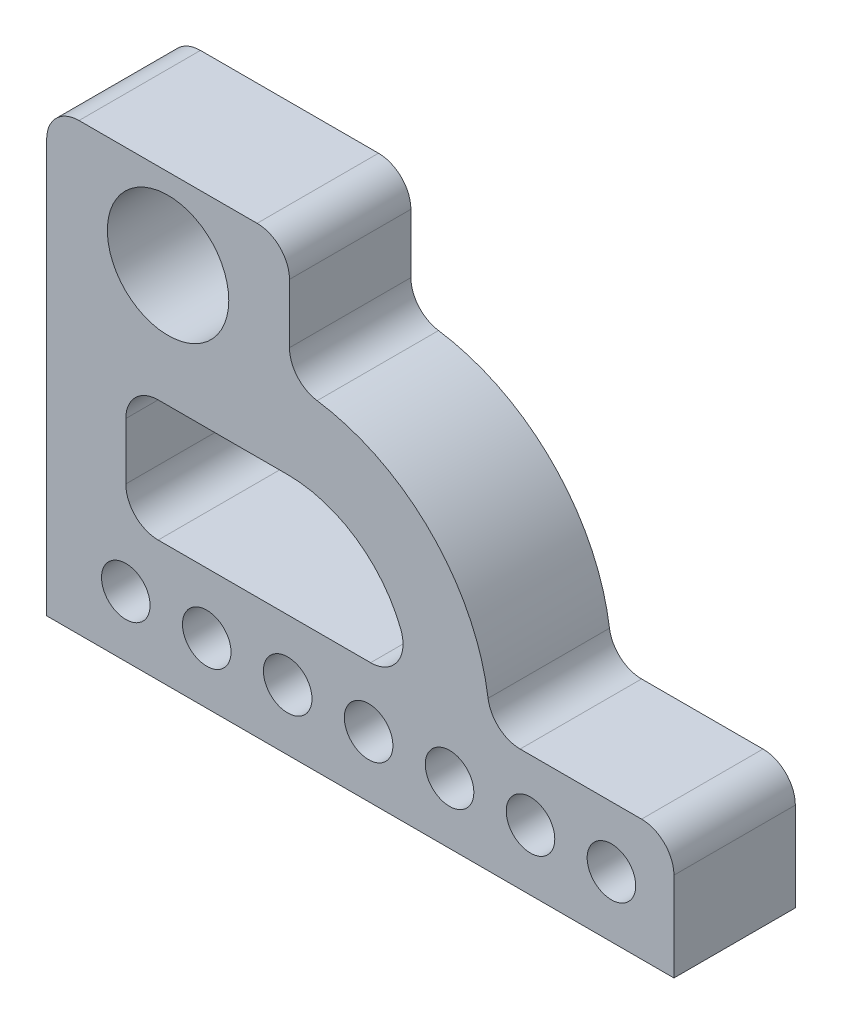
ISO-10303-21;
HEADER;
FILE_DESCRIPTION(('STEP AP214'),'2;1');
FILE_NAME('part.step','',(''),(''),'','','');
FILE_SCHEMA(('AUTOMOTIVE_DESIGN { 1 0 10303 214 1 1 1 1 }'));
ENDSEC;
DATA;
#1=APPLICATION_CONTEXT('core data for automotive mechanical design processes');
#2=APPLICATION_PROTOCOL_DEFINITION('international standard','automotive_design',2000,#1);
#3=PRODUCT_CONTEXT('',#1,'mechanical');
#4=PRODUCT('Part','Part','',(#3));
#5=PRODUCT_RELATED_PRODUCT_CATEGORY('part','',(#4));
#6=PRODUCT_DEFINITION_FORMATION('','',#4);
#7=PRODUCT_DEFINITION_CONTEXT('part definition',#1,'design');
#8=PRODUCT_DEFINITION('design','',#6,#7);
#9=PRODUCT_DEFINITION_SHAPE('','',#8);
#10=(LENGTH_UNIT() NAMED_UNIT(*) SI_UNIT(.MILLI.,.METRE.));
#11=(NAMED_UNIT(*) PLANE_ANGLE_UNIT() SI_UNIT($,.RADIAN.));
#12=(NAMED_UNIT(*) SI_UNIT($,.STERADIAN.) SOLID_ANGLE_UNIT());
#13=UNCERTAINTY_MEASURE_WITH_UNIT(LENGTH_MEASURE(1.E-05),#10,'distance_accuracy_value','');
#14=(GEOMETRIC_REPRESENTATION_CONTEXT(3) GLOBAL_UNCERTAINTY_ASSIGNED_CONTEXT((#13)) GLOBAL_UNIT_ASSIGNED_CONTEXT((#10,
#11,#12)) REPRESENTATION_CONTEXT('',''));
#15=CARTESIAN_POINT('',(0.,0.,0.));
#16=DIRECTION('',(0.,0.,1.));
#17=DIRECTION('',(1.,0.,0.));
#18=AXIS2_PLACEMENT_3D('',#15,#16,#17);
#19=CARTESIAN_POINT('',(-51.5559205852614,86.4434594596879,30.));
#20=DIRECTION('',(0.,0.,-1.));
#21=DIRECTION('',(-1.,0.,0.));
#22=AXIS2_PLACEMENT_3D('',#19,#20,#21);
#23=PLANE('',#22);
#24=CARTESIAN_POINT('',(-29.5559205852614,74.4434594596878,30.));
#25=DIRECTION('',(0.,0.,1.));
#26=DIRECTION('',(1.,0.,0.));
#27=AXIS2_PLACEMENT_3D('',#24,#25,#26);
#28=CIRCLE('',#27,15.);
#29=CARTESIAN_POINT('',(-14.5559205852614,74.4434594596878,30.));
#30=VERTEX_POINT('',#29);
#31=EDGE_CURVE('E260',#30,#30,#28,.T.);
#32=ORIENTED_EDGE('',*,*,#31,.F.);
#33=EDGE_LOOP('',(#32));
#34=FACE_BOUND('',#33,.T.);
#35=DIRECTION('',(0.,-1.,0.));
#36=VECTOR('',#35,1.);
#37=CARTESIAN_POINT('',(-59.5559205852614,-15.5565405403121,30.));
#38=LINE('',#37,#36);
#39=CARTESIAN_POINT('',(-59.5559205852614,86.4434594596878,30.));
#40=VERTEX_POINT('',#39);
#41=CARTESIAN_POINT('',(-59.5559205852614,-15.5565405403121,30.));
#42=VERTEX_POINT('',#41);
#43=EDGE_CURVE('E270',#40,#42,#38,.T.);
#44=ORIENTED_EDGE('',*,*,#43,.T.);
#45=DIRECTION('',(1.,0.,0.));
#46=VECTOR('',#45,1.);
#47=CARTESIAN_POINT('',(-59.5559205852614,-15.5565405403121,30.));
#48=LINE('',#47,#46);
#49=CARTESIAN_POINT('',(95.4440794147386,-15.5565405403121,30.));
#50=VERTEX_POINT('',#49);
#51=EDGE_CURVE('E271',#42,#50,#48,.T.);
#52=ORIENTED_EDGE('',*,*,#51,.T.);
#53=DIRECTION('',(0.,1.,0.));
#54=VECTOR('',#53,1.);
#55=CARTESIAN_POINT('',(95.4440794147386,-15.5565405403121,30.));
#56=LINE('',#55,#54);
#57=CARTESIAN_POINT('',(95.4440794147386,6.4434594596878,30.));
#58=VERTEX_POINT('',#57);
#59=EDGE_CURVE('E274',#50,#58,#56,.T.);
#60=ORIENTED_EDGE('',*,*,#59,.T.);
#61=CARTESIAN_POINT('',(87.4440794147386,6.44345945968786,30.));
#62=DIRECTION('',(0.,0.,1.));
#63=DIRECTION('',(1.,0.,0.));
#64=AXIS2_PLACEMENT_3D('',#61,#62,#63);
#65=CIRCLE('',#64,8.);
#66=CARTESIAN_POINT('',(87.4440794147386,14.4434594596879,30.));
#67=VERTEX_POINT('',#66);
#68=EDGE_CURVE('E277',#58,#67,#65,.T.);
#69=ORIENTED_EDGE('',*,*,#68,.T.);
#70=DIRECTION('',(-1.,0.,0.));
#71=VECTOR('',#70,1.);
#72=CARTESIAN_POINT('',(87.4440794147386,14.4434594596879,30.));
#73=LINE('',#72,#71);
#74=CARTESIAN_POINT('',(57.4456264653803,14.4434594596879,30.));
#75=VERTEX_POINT('',#74);
#76=EDGE_CURVE('E282',#67,#75,#73,.T.);
#77=ORIENTED_EDGE('',*,*,#76,.T.);
#78=CARTESIAN_POINT('',(57.4456264653803,22.4434594596879,30.));
#79=DIRECTION('',(0.,0.,-1.));
#80=DIRECTION('',(-1.,0.,0.));
#81=AXIS2_PLACEMENT_3D('',#78,#79,#80);
#82=CIRCLE('',#81,8.);
#83=CARTESIAN_POINT('',(49.5220917805002,21.3400111838258,30.));
#84=VERTEX_POINT('',#83);
#85=EDGE_CURVE('E281',#75,#84,#82,.T.);
#86=ORIENTED_EDGE('',*,*,#85,.T.);
#87=CARTESIAN_POINT('',(0.,14.4434594596879,30.));
#88=DIRECTION('',(0.,0.,1.));
#89=DIRECTION('',(1.,0.,0.));
#90=AXIS2_PLACEMENT_3D('',#87,#88,#89);
#91=CIRCLE('',#90,50.);
#92=CARTESIAN_POINT('',(7.27937880580915,63.9107278722608,30.));
#93=VERTEX_POINT('',#92);
#94=EDGE_CURVE('E287',#84,#93,#91,.T.);
#95=ORIENTED_EDGE('',*,*,#94,.T.);
#96=CARTESIAN_POINT('',(8.44407941473862,71.8254908182725,30.));
#97=DIRECTION('',(0.,0.,-1.));
#98=DIRECTION('',(-1.,0.,0.));
#99=AXIS2_PLACEMENT_3D('',#96,#97,#98);
#100=CIRCLE('',#99,8.);
#101=CARTESIAN_POINT('',(0.444079414738612,71.8254908182725,30.));
#102=VERTEX_POINT('',#101);
#103=EDGE_CURVE('E290',#93,#102,#100,.T.);
#104=ORIENTED_EDGE('',*,*,#103,.T.);
#105=DIRECTION('',(0.,1.,0.));
#106=VECTOR('',#105,1.);
#107=CARTESIAN_POINT('',(0.444079414738613,86.4434594596878,30.));
#108=LINE('',#107,#106);
#109=CARTESIAN_POINT('',(0.444079414738613,86.4434594596878,30.));
#110=VERTEX_POINT('',#109);
#111=EDGE_CURVE('E291',#102,#110,#108,.T.);
#112=ORIENTED_EDGE('',*,*,#111,.T.);
#113=CARTESIAN_POINT('',(-7.55592058526139,86.4434594596879,30.));
#114=DIRECTION('',(0.,0.,1.));
#115=DIRECTION('',(1.,0.,0.));
#116=AXIS2_PLACEMENT_3D('',#113,#114,#115);
#117=CIRCLE('',#116,8.);
#118=CARTESIAN_POINT('',(-7.55592058526144,94.4434594596879,30.));
#119=VERTEX_POINT('',#118);
#120=EDGE_CURVE('E296',#110,#119,#117,.T.);
#121=ORIENTED_EDGE('',*,*,#120,.T.);
#122=DIRECTION('',(-1.,0.,0.));
#123=VECTOR('',#122,1.);
#124=CARTESIAN_POINT('',(-51.5559205852613,94.4434594596878,30.));
#125=LINE('',#124,#123);
#126=CARTESIAN_POINT('',(-51.5559205852613,94.4434594596878,30.));
#127=VERTEX_POINT('',#126);
#128=EDGE_CURVE('E298',#119,#127,#125,.T.);
#129=ORIENTED_EDGE('',*,*,#128,.T.);
#130=CARTESIAN_POINT('',(-51.5559205852614,86.4434594596879,30.));
#131=DIRECTION('',(0.,0.,1.));
#132=DIRECTION('',(-1.,0.,0.));
#133=AXIS2_PLACEMENT_3D('',#130,#131,#132);
#134=CIRCLE('',#133,8.);
#135=EDGE_CURVE('E302',#127,#40,#134,.T.);
#136=ORIENTED_EDGE('',*,*,#135,.T.);
#137=EDGE_LOOP('',(#44,#52,#60,#69,#77,#86,#95,#104,#112,#121,#129,#136));
#138=FACE_BOUND('',#137,.T.);
#139=CARTESIAN_POINT('',(0.,14.4434594596879,30.));
#140=DIRECTION('',(0.,0.,1.));
#141=DIRECTION('',(1.,0.,0.));
#142=AXIS2_PLACEMENT_3D('',#139,#140,#141);
#143=CIRCLE('',#142,30.);
#144=CARTESIAN_POINT('',(27.946229361708,25.3525503687788,30.));
#145=VERTEX_POINT('',#144);
#146=CARTESIAN_POINT('',(0.,44.4434594596879,30.));
#147=VERTEX_POINT('',#146);
#148=EDGE_CURVE('E180',#145,#147,#143,.T.);
#149=ORIENTED_EDGE('',*,*,#148,.F.);
#150=CARTESIAN_POINT('',(20.4939015319192,22.4434594596879,30.));
#151=DIRECTION('',(0.,0.,1.));
#152=DIRECTION('',(1.,0.,0.));
#153=AXIS2_PLACEMENT_3D('',#150,#151,#152);
#154=CIRCLE('',#153,8.);
#155=CARTESIAN_POINT('',(20.4939015319192,14.4434594596879,30.));
#156=VERTEX_POINT('',#155);
#157=EDGE_CURVE('E220',#156,#145,#154,.T.);
#158=ORIENTED_EDGE('',*,*,#157,.F.);
#159=DIRECTION('',(1.,0.,0.));
#160=VECTOR('',#159,1.);
#161=CARTESIAN_POINT('',(-32.,14.4434594596879,30.));
#162=LINE('',#161,#160);
#163=CARTESIAN_POINT('',(-32.,14.4434594596879,30.));
#164=VERTEX_POINT('',#163);
#165=EDGE_CURVE('E215',#164,#156,#162,.T.);
#166=ORIENTED_EDGE('',*,*,#165,.F.);
#167=CARTESIAN_POINT('',(-32.,22.4434594596879,30.));
#168=DIRECTION('',(0.,0.,1.));
#169=DIRECTION('',(-1.,0.,0.));
#170=AXIS2_PLACEMENT_3D('',#167,#168,#169);
#171=CIRCLE('',#170,8.);
#172=CARTESIAN_POINT('',(-40.,22.4434594596879,30.));
#173=VERTEX_POINT('',#172);
#174=EDGE_CURVE('E213',#173,#164,#171,.T.);
#175=ORIENTED_EDGE('',*,*,#174,.F.);
#176=DIRECTION('',(0.,-1.,0.));
#177=VECTOR('',#176,1.);
#178=CARTESIAN_POINT('',(-40.,36.4434594596878,30.));
#179=LINE('',#178,#177);
#180=CARTESIAN_POINT('',(-40.,36.4434594596878,30.));
#181=VERTEX_POINT('',#180);
#182=EDGE_CURVE('E203',#181,#173,#179,.T.);
#183=ORIENTED_EDGE('',*,*,#182,.F.);
#184=CARTESIAN_POINT('',(-32.,36.4434594596879,30.));
#185=DIRECTION('',(0.,0.,1.));
#186=DIRECTION('',(-1.,0.,0.));
#187=AXIS2_PLACEMENT_3D('',#184,#185,#186);
#188=CIRCLE('',#187,8.);
#189=CARTESIAN_POINT('',(-32.,44.4434594596879,30.));
#190=VERTEX_POINT('',#189);
#191=EDGE_CURVE('E202',#190,#181,#188,.T.);
#192=ORIENTED_EDGE('',*,*,#191,.F.);
#193=DIRECTION('',(-1.,0.,0.));
#194=VECTOR('',#193,1.);
#195=CARTESIAN_POINT('',(0.,44.4434594596879,30.));
#196=LINE('',#195,#194);
#197=EDGE_CURVE('E186',#147,#190,#196,.T.);
#198=ORIENTED_EDGE('',*,*,#197,.F.);
#199=EDGE_LOOP('',(#149,#158,#166,#175,#183,#192,#198));
#200=FACE_BOUND('',#199,.T.);
#201=CARTESIAN_POINT('',(-40.,-0.556540540312144,30.));
#202=DIRECTION('',(0.,0.,1.));
#203=DIRECTION('',(1.,0.,0.));
#204=AXIS2_PLACEMENT_3D('',#201,#202,#203);
#205=CIRCLE('',#204,6.);
#206=CARTESIAN_POINT('',(-34.,-0.556540540312144,30.));
#207=VERTEX_POINT('',#206);
#208=EDGE_CURVE('E225',#207,#207,#205,.T.);
#209=ORIENTED_EDGE('',*,*,#208,.F.);
#210=EDGE_LOOP('',(#209));
#211=FACE_BOUND('',#210,.T.);
#212=CARTESIAN_POINT('',(-20.,-0.556540540312144,30.));
#213=DIRECTION('',(0.,0.,1.));
#214=DIRECTION('',(1.,0.,0.));
#215=AXIS2_PLACEMENT_3D('',#212,#213,#214);
#216=CIRCLE('',#215,6.);
#217=CARTESIAN_POINT('',(-14.,-0.556540540312144,30.));
#218=VERTEX_POINT('',#217);
#219=EDGE_CURVE('E746',#218,#218,#216,.T.);
#220=ORIENTED_EDGE('',*,*,#219,.F.);
#221=EDGE_LOOP('',(#220));
#222=FACE_BOUND('',#221,.T.);
#223=CARTESIAN_POINT('',(0.,-0.556540540312144,30.));
#224=DIRECTION('',(0.,0.,1.));
#225=DIRECTION('',(1.,0.,0.));
#226=AXIS2_PLACEMENT_3D('',#223,#224,#225);
#227=CIRCLE('',#226,6.);
#228=CARTESIAN_POINT('',(6.,-0.556540540312144,30.));
#229=VERTEX_POINT('',#228);
#230=EDGE_CURVE('E739',#229,#229,#227,.T.);
#231=ORIENTED_EDGE('',*,*,#230,.F.);
#232=EDGE_LOOP('',(#231));
#233=FACE_BOUND('',#232,.T.);
#234=CARTESIAN_POINT('',(20.,-0.556540540312144,30.));
#235=DIRECTION('',(0.,0.,1.));
#236=DIRECTION('',(1.,0.,0.));
#237=AXIS2_PLACEMENT_3D('',#234,#235,#236);
#238=CIRCLE('',#237,6.);
#239=CARTESIAN_POINT('',(26.,-0.556540540312144,30.));
#240=VERTEX_POINT('',#239);
#241=EDGE_CURVE('E729',#240,#240,#238,.T.);
#242=ORIENTED_EDGE('',*,*,#241,.F.);
#243=EDGE_LOOP('',(#242));
#244=FACE_BOUND('',#243,.T.);
#245=CARTESIAN_POINT('',(40.,-0.556540540312144,30.));
#246=DIRECTION('',(0.,0.,1.));
#247=DIRECTION('',(1.,0.,0.));
#248=AXIS2_PLACEMENT_3D('',#245,#246,#247);
#249=CIRCLE('',#248,6.);
#250=CARTESIAN_POINT('',(46.,-0.556540540312144,30.));
#251=VERTEX_POINT('',#250);
#252=EDGE_CURVE('E725',#251,#251,#249,.T.);
#253=ORIENTED_EDGE('',*,*,#252,.F.);
#254=EDGE_LOOP('',(#253));
#255=FACE_BOUND('',#254,.T.);
#256=CARTESIAN_POINT('',(60.,-0.556540540312144,30.));
#257=DIRECTION('',(0.,0.,1.));
#258=DIRECTION('',(1.,0.,0.));
#259=AXIS2_PLACEMENT_3D('',#256,#257,#258);
#260=CIRCLE('',#259,6.);
#261=CARTESIAN_POINT('',(66.,-0.556540540312144,30.));
#262=VERTEX_POINT('',#261);
#263=EDGE_CURVE('E714',#262,#262,#260,.T.);
#264=ORIENTED_EDGE('',*,*,#263,.F.);
#265=EDGE_LOOP('',(#264));
#266=FACE_BOUND('',#265,.T.);
#267=CARTESIAN_POINT('',(80.,-0.556540540312144,30.));
#268=DIRECTION('',(0.,0.,1.));
#269=DIRECTION('',(1.,0.,0.));
#270=AXIS2_PLACEMENT_3D('',#267,#268,#269);
#271=CIRCLE('',#270,6.);
#272=CARTESIAN_POINT('',(86.,-0.556540540312144,30.));
#273=VERTEX_POINT('',#272);
#274=EDGE_CURVE('E704',#273,#273,#271,.T.);
#275=ORIENTED_EDGE('',*,*,#274,.F.);
#276=EDGE_LOOP('',(#275));
#277=FACE_BOUND('',#276,.T.);
#278=ADVANCED_FACE('F44',(#34,#138,#200,#211,#222,#233,#244,#255,#266,#277),#23,.F.);
#279=CARTESIAN_POINT('',(-51.5559205852614,86.4434594596879,0.));
#280=DIRECTION('',(0.,0.,-1.));
#281=DIRECTION('',(-1.,0.,0.));
#282=AXIS2_PLACEMENT_3D('',#279,#280,#281);
#283=PLANE('',#282);
#284=CARTESIAN_POINT('',(60.,-0.556540540312144,0.));
#285=DIRECTION('',(0.,0.,1.));
#286=DIRECTION('',(1.,0.,0.));
#287=AXIS2_PLACEMENT_3D('',#284,#285,#286);
#288=CIRCLE('',#287,6.);
#289=CARTESIAN_POINT('',(66.,-0.556540540312144,0.));
#290=VERTEX_POINT('',#289);
#291=EDGE_CURVE('E713',#290,#290,#288,.T.);
#292=ORIENTED_EDGE('',*,*,#291,.T.);
#293=EDGE_LOOP('',(#292));
#294=FACE_BOUND('',#293,.T.);
#295=CARTESIAN_POINT('',(20.,-0.556540540312144,0.));
#296=DIRECTION('',(0.,0.,1.));
#297=DIRECTION('',(1.,0.,0.));
#298=AXIS2_PLACEMENT_3D('',#295,#296,#297);
#299=CIRCLE('',#298,6.);
#300=CARTESIAN_POINT('',(26.,-0.556540540312144,0.));
#301=VERTEX_POINT('',#300);
#302=EDGE_CURVE('E726',#301,#301,#299,.T.);
#303=ORIENTED_EDGE('',*,*,#302,.T.);
#304=EDGE_LOOP('',(#303));
#305=FACE_BOUND('',#304,.T.);
#306=CARTESIAN_POINT('',(-20.,-0.556540540312144,0.));
#307=DIRECTION('',(0.,0.,1.));
#308=DIRECTION('',(1.,0.,0.));
#309=AXIS2_PLACEMENT_3D('',#306,#307,#308);
#310=CIRCLE('',#309,6.);
#311=CARTESIAN_POINT('',(-14.,-0.556540540312144,0.));
#312=VERTEX_POINT('',#311);
#313=EDGE_CURVE('E745',#312,#312,#310,.T.);
#314=ORIENTED_EDGE('',*,*,#313,.T.);
#315=EDGE_LOOP('',(#314));
#316=FACE_BOUND('',#315,.T.);
#317=CARTESIAN_POINT('',(20.4939015319192,22.4434594596879,0.));
#318=DIRECTION('',(0.,0.,1.));
#319=DIRECTION('',(1.,0.,0.));
#320=AXIS2_PLACEMENT_3D('',#317,#318,#319);
#321=CIRCLE('',#320,8.);
#322=CARTESIAN_POINT('',(20.4939015319192,14.4434594596879,0.));
#323=VERTEX_POINT('',#322);
#324=CARTESIAN_POINT('',(27.946229361708,25.3525503687788,0.));
#325=VERTEX_POINT('',#324);
#326=EDGE_CURVE('E190',#323,#325,#321,.T.);
#327=ORIENTED_EDGE('',*,*,#326,.T.);
#328=CARTESIAN_POINT('',(0.,14.4434594596879,0.));
#329=DIRECTION('',(0.,0.,1.));
#330=DIRECTION('',(1.,0.,0.));
#331=AXIS2_PLACEMENT_3D('',#328,#329,#330);
#332=CIRCLE('',#331,30.);
#333=CARTESIAN_POINT('',(0.,44.4434594596879,0.));
#334=VERTEX_POINT('',#333);
#335=EDGE_CURVE('E69',#325,#334,#332,.T.);
#336=ORIENTED_EDGE('',*,*,#335,.T.);
#337=DIRECTION('',(-1.,0.,0.));
#338=VECTOR('',#337,1.);
#339=CARTESIAN_POINT('',(0.,44.4434594596879,0.));
#340=LINE('',#339,#338);
#341=CARTESIAN_POINT('',(-32.,44.4434594596879,0.));
#342=VERTEX_POINT('',#341);
#343=EDGE_CURVE('E194',#334,#342,#340,.T.);
#344=ORIENTED_EDGE('',*,*,#343,.T.);
#345=CARTESIAN_POINT('',(-32.,36.4434594596879,0.));
#346=DIRECTION('',(0.,0.,1.));
#347=DIRECTION('',(-1.,0.,0.));
#348=AXIS2_PLACEMENT_3D('',#345,#346,#347);
#349=CIRCLE('',#348,8.);
#350=CARTESIAN_POINT('',(-40.,36.4434594596878,0.));
#351=VERTEX_POINT('',#350);
#352=EDGE_CURVE('E224',#342,#351,#349,.T.);
#353=ORIENTED_EDGE('',*,*,#352,.T.);
#354=DIRECTION('',(0.,-1.,0.));
#355=VECTOR('',#354,1.);
#356=CARTESIAN_POINT('',(-40.,36.4434594596878,0.));
#357=LINE('',#356,#355);
#358=CARTESIAN_POINT('',(-40.,22.4434594596879,0.));
#359=VERTEX_POINT('',#358);
#360=EDGE_CURVE('E227',#351,#359,#357,.T.);
#361=ORIENTED_EDGE('',*,*,#360,.T.);
#362=CARTESIAN_POINT('',(-32.,22.4434594596879,0.));
#363=DIRECTION('',(0.,0.,1.));
#364=DIRECTION('',(-1.,0.,0.));
#365=AXIS2_PLACEMENT_3D('',#362,#363,#364);
#366=CIRCLE('',#365,8.);
#367=CARTESIAN_POINT('',(-32.,14.4434594596879,0.));
#368=VERTEX_POINT('',#367);
#369=EDGE_CURVE('E232',#359,#368,#366,.T.);
#370=ORIENTED_EDGE('',*,*,#369,.T.);
#371=DIRECTION('',(1.,0.,0.));
#372=VECTOR('',#371,1.);
#373=CARTESIAN_POINT('',(-32.,14.4434594596879,0.));
#374=LINE('',#373,#372);
#375=EDGE_CURVE('E240',#368,#323,#374,.T.);
#376=ORIENTED_EDGE('',*,*,#375,.T.);
#377=EDGE_LOOP('',(#327,#336,#344,#353,#361,#370,#376));
#378=FACE_BOUND('',#377,.T.);
#379=CARTESIAN_POINT('',(-29.5559205852614,74.4434594596878,0.));
#380=DIRECTION('',(0.,0.,1.));
#381=DIRECTION('',(1.,0.,0.));
#382=AXIS2_PLACEMENT_3D('',#379,#380,#381);
#383=CIRCLE('',#382,15.);
#384=CARTESIAN_POINT('',(-14.5559205852614,74.4434594596878,0.));
#385=VERTEX_POINT('',#384);
#386=EDGE_CURVE('E193',#385,#385,#383,.T.);
#387=ORIENTED_EDGE('',*,*,#386,.T.);
#388=EDGE_LOOP('',(#387));
#389=FACE_BOUND('',#388,.T.);
#390=DIRECTION('',(0.,-1.,0.));
#391=VECTOR('',#390,1.);
#392=CARTESIAN_POINT('',(-59.5559205852614,-15.5565405403121,0.));
#393=LINE('',#392,#391);
#394=CARTESIAN_POINT('',(-59.5559205852614,86.4434594596878,0.));
#395=VERTEX_POINT('',#394);
#396=CARTESIAN_POINT('',(-59.5559205852614,-15.5565405403121,0.));
#397=VERTEX_POINT('',#396);
#398=EDGE_CURVE('E261',#395,#397,#393,.T.);
#399=ORIENTED_EDGE('',*,*,#398,.F.);
#400=CARTESIAN_POINT('',(-51.5559205852614,86.4434594596879,0.));
#401=DIRECTION('',(0.,0.,1.));
#402=DIRECTION('',(-1.,0.,0.));
#403=AXIS2_PLACEMENT_3D('',#400,#401,#402);
#404=CIRCLE('',#403,8.);
#405=CARTESIAN_POINT('',(-51.5559205852613,94.4434594596878,0.));
#406=VERTEX_POINT('',#405);
#407=EDGE_CURVE('E275',#406,#395,#404,.T.);
#408=ORIENTED_EDGE('',*,*,#407,.F.);
#409=DIRECTION('',(-1.,0.,0.));
#410=VECTOR('',#409,1.);
#411=CARTESIAN_POINT('',(-51.5559205852613,94.4434594596878,0.));
#412=LINE('',#411,#410);
#413=CARTESIAN_POINT('',(-7.55592058526144,94.4434594596879,0.));
#414=VERTEX_POINT('',#413);
#415=EDGE_CURVE('E337',#414,#406,#412,.T.);
#416=ORIENTED_EDGE('',*,*,#415,.F.);
#417=CARTESIAN_POINT('',(-7.55592058526139,86.4434594596879,0.));
#418=DIRECTION('',(0.,0.,1.));
#419=DIRECTION('',(1.,0.,0.));
#420=AXIS2_PLACEMENT_3D('',#417,#418,#419);
#421=CIRCLE('',#420,8.);
#422=CARTESIAN_POINT('',(0.444079414738613,86.4434594596878,0.));
#423=VERTEX_POINT('',#422);
#424=EDGE_CURVE('E334',#423,#414,#421,.T.);
#425=ORIENTED_EDGE('',*,*,#424,.F.);
#426=DIRECTION('',(0.,1.,0.));
#427=VECTOR('',#426,1.);
#428=CARTESIAN_POINT('',(0.444079414738613,86.4434594596878,0.));
#429=LINE('',#428,#427);
#430=CARTESIAN_POINT('',(0.444079414738612,71.8254908182725,0.));
#431=VERTEX_POINT('',#430);
#432=EDGE_CURVE('E328',#431,#423,#429,.T.);
#433=ORIENTED_EDGE('',*,*,#432,.F.);
#434=CARTESIAN_POINT('',(8.44407941473862,71.8254908182725,0.));
#435=DIRECTION('',(0.,0.,-1.));
#436=DIRECTION('',(-1.,0.,0.));
#437=AXIS2_PLACEMENT_3D('',#434,#435,#436);
#438=CIRCLE('',#437,8.);
#439=CARTESIAN_POINT('',(7.27937880580915,63.9107278722608,0.));
#440=VERTEX_POINT('',#439);
#441=EDGE_CURVE('E330',#440,#431,#438,.T.);
#442=ORIENTED_EDGE('',*,*,#441,.F.);
#443=CARTESIAN_POINT('',(0.,14.4434594596879,0.));
#444=DIRECTION('',(0.,0.,1.));
#445=DIRECTION('',(1.,0.,0.));
#446=AXIS2_PLACEMENT_3D('',#443,#444,#445);
#447=CIRCLE('',#446,50.);
#448=CARTESIAN_POINT('',(49.5220917805002,21.3400111838258,0.));
#449=VERTEX_POINT('',#448);
#450=EDGE_CURVE('E323',#449,#440,#447,.T.);
#451=ORIENTED_EDGE('',*,*,#450,.F.);
#452=CARTESIAN_POINT('',(57.4456264653803,22.4434594596879,0.));
#453=DIRECTION('',(0.,0.,-1.));
#454=DIRECTION('',(-1.,0.,0.));
#455=AXIS2_PLACEMENT_3D('',#452,#453,#454);
#456=CIRCLE('',#455,8.);
#457=CARTESIAN_POINT('',(57.4456264653803,14.4434594596879,0.));
#458=VERTEX_POINT('',#457);
#459=EDGE_CURVE('E321',#458,#449,#456,.T.);
#460=ORIENTED_EDGE('',*,*,#459,.F.);
#461=DIRECTION('',(-1.,0.,0.));
#462=VECTOR('',#461,1.);
#463=CARTESIAN_POINT('',(87.4440794147386,14.4434594596879,0.));
#464=LINE('',#463,#462);
#465=CARTESIAN_POINT('',(87.4440794147386,14.4434594596879,0.));
#466=VERTEX_POINT('',#465);
#467=EDGE_CURVE('E318',#466,#458,#464,.T.);
#468=ORIENTED_EDGE('',*,*,#467,.F.);
#469=CARTESIAN_POINT('',(87.4440794147386,6.44345945968786,0.));
#470=DIRECTION('',(0.,0.,1.));
#471=DIRECTION('',(1.,0.,0.));
#472=AXIS2_PLACEMENT_3D('',#469,#470,#471);
#473=CIRCLE('',#472,8.);
#474=CARTESIAN_POINT('',(95.4440794147386,6.4434594596878,0.));
#475=VERTEX_POINT('',#474);
#476=EDGE_CURVE('E314',#475,#466,#473,.T.);
#477=ORIENTED_EDGE('',*,*,#476,.F.);
#478=DIRECTION('',(0.,1.,0.));
#479=VECTOR('',#478,1.);
#480=CARTESIAN_POINT('',(95.4440794147386,-15.5565405403121,0.));
#481=LINE('',#480,#479);
#482=CARTESIAN_POINT('',(95.4440794147386,-15.5565405403121,0.));
#483=VERTEX_POINT('',#482);
#484=EDGE_CURVE('E315',#483,#475,#481,.T.);
#485=ORIENTED_EDGE('',*,*,#484,.F.);
#486=DIRECTION('',(1.,0.,0.));
#487=VECTOR('',#486,1.);
#488=CARTESIAN_POINT('',(-59.5559205852614,-15.5565405403121,0.));
#489=LINE('',#488,#487);
#490=EDGE_CURVE('E309',#397,#483,#489,.T.);
#491=ORIENTED_EDGE('',*,*,#490,.F.);
#492=EDGE_LOOP('',(#399,#408,#416,#425,#433,#442,#451,#460,#468,#477,#485,#491));
#493=FACE_BOUND('',#492,.T.);
#494=CARTESIAN_POINT('',(-40.,-0.556540540312144,0.));
#495=DIRECTION('',(0.,0.,1.));
#496=DIRECTION('',(1.,0.,0.));
#497=AXIS2_PLACEMENT_3D('',#494,#495,#496);
#498=CIRCLE('',#497,6.);
#499=CARTESIAN_POINT('',(-34.,-0.556540540312144,0.));
#500=VERTEX_POINT('',#499);
#501=EDGE_CURVE('E750',#500,#500,#498,.T.);
#502=ORIENTED_EDGE('',*,*,#501,.T.);
#503=EDGE_LOOP('',(#502));
#504=FACE_BOUND('',#503,.T.);
#505=CARTESIAN_POINT('',(0.,-0.556540540312144,0.));
#506=DIRECTION('',(0.,0.,1.));
#507=DIRECTION('',(1.,0.,0.));
#508=AXIS2_PLACEMENT_3D('',#505,#506,#507);
#509=CIRCLE('',#508,6.);
#510=CARTESIAN_POINT('',(6.,-0.556540540312144,0.));
#511=VERTEX_POINT('',#510);
#512=EDGE_CURVE('E731',#511,#511,#509,.T.);
#513=ORIENTED_EDGE('',*,*,#512,.T.);
#514=EDGE_LOOP('',(#513));
#515=FACE_BOUND('',#514,.T.);
#516=CARTESIAN_POINT('',(40.,-0.556540540312144,0.));
#517=DIRECTION('',(0.,0.,1.));
#518=DIRECTION('',(1.,0.,0.));
#519=AXIS2_PLACEMENT_3D('',#516,#517,#518);
#520=CIRCLE('',#519,6.);
#521=CARTESIAN_POINT('',(46.,-0.556540540312144,0.));
#522=VERTEX_POINT('',#521);
#523=EDGE_CURVE('E718',#522,#522,#520,.T.);
#524=ORIENTED_EDGE('',*,*,#523,.T.);
#525=EDGE_LOOP('',(#524));
#526=FACE_BOUND('',#525,.T.);
#527=CARTESIAN_POINT('',(80.,-0.556540540312144,0.));
#528=DIRECTION('',(0.,0.,1.));
#529=DIRECTION('',(1.,0.,0.));
#530=AXIS2_PLACEMENT_3D('',#527,#528,#529);
#531=CIRCLE('',#530,6.);
#532=CARTESIAN_POINT('',(86.,-0.556540540312144,0.));
#533=VERTEX_POINT('',#532);
#534=EDGE_CURVE('E708',#533,#533,#531,.T.);
#535=ORIENTED_EDGE('',*,*,#534,.T.);
#536=EDGE_LOOP('',(#535));
#537=FACE_BOUND('',#536,.T.);
#538=ADVANCED_FACE('F393',(#294,#305,#316,#378,#389,#493,#504,#515,#526,#537),#283,.T.);
#539=CARTESIAN_POINT('',(-59.5559205852614,-15.5565405403121,30.));
#540=DIRECTION('',(1.,0.,0.));
#541=DIRECTION('',(0.,0.,-1.));
#542=AXIS2_PLACEMENT_3D('',#539,#540,#541);
#543=PLANE('',#542);
#544=ORIENTED_EDGE('',*,*,#398,.T.);
#545=DIRECTION('',(0.,0.,-1.));
#546=VECTOR('',#545,1.);
#547=CARTESIAN_POINT('',(-59.5559205852614,-15.5565405403121,30.));
#548=LINE('',#547,#546);
#549=EDGE_CURVE('E11',#42,#397,#548,.T.);
#550=ORIENTED_EDGE('',*,*,#549,.F.);
#551=ORIENTED_EDGE('',*,*,#43,.F.);
#552=DIRECTION('',(0.,0.,-1.));
#553=VECTOR('',#552,1.);
#554=CARTESIAN_POINT('',(-59.5559205852614,86.4434594596878,30.));
#555=LINE('',#554,#553);
#556=EDGE_CURVE('E304',#40,#395,#555,.T.);
#557=ORIENTED_EDGE('',*,*,#556,.T.);
#558=EDGE_LOOP('',(#544,#550,#551,#557));
#559=FACE_BOUND('',#558,.T.);
#560=ADVANCED_FACE('F50',(#559),#543,.F.);
#561=CARTESIAN_POINT('',(-59.5559205852614,-15.5565405403121,30.));
#562=DIRECTION('',(0.,1.,0.));
#563=DIRECTION('',(0.,0.,1.));
#564=AXIS2_PLACEMENT_3D('',#561,#562,#563);
#565=PLANE('',#564);
#566=ORIENTED_EDGE('',*,*,#490,.T.);
#567=DIRECTION('',(0.,0.,-1.));
#568=VECTOR('',#567,1.);
#569=CARTESIAN_POINT('',(95.4440794147386,-15.5565405403121,30.));
#570=LINE('',#569,#568);
#571=EDGE_CURVE('E53',#50,#483,#570,.T.);
#572=ORIENTED_EDGE('',*,*,#571,.F.);
#573=ORIENTED_EDGE('',*,*,#51,.F.);
#574=ORIENTED_EDGE('',*,*,#549,.T.);
#575=EDGE_LOOP('',(#566,#572,#573,#574));
#576=FACE_BOUND('',#575,.T.);
#577=ADVANCED_FACE('F408',(#576),#565,.F.);
#578=CARTESIAN_POINT('',(95.4440794147386,-15.5565405403121,30.));
#579=DIRECTION('',(-1.,0.,0.));
#580=DIRECTION('',(0.,0.,1.));
#581=AXIS2_PLACEMENT_3D('',#578,#579,#580);
#582=PLANE('',#581);
#583=ORIENTED_EDGE('',*,*,#484,.T.);
#584=DIRECTION('',(0.,0.,-1.));
#585=VECTOR('',#584,1.);
#586=CARTESIAN_POINT('',(95.4440794147386,6.4434594596878,30.));
#587=LINE('',#586,#585);
#588=EDGE_CURVE('E376',#58,#475,#587,.T.);
#589=ORIENTED_EDGE('',*,*,#588,.F.);
#590=ORIENTED_EDGE('',*,*,#59,.F.);
#591=ORIENTED_EDGE('',*,*,#571,.T.);
#592=EDGE_LOOP('',(#583,#589,#590,#591));
#593=FACE_BOUND('',#592,.T.);
#594=ADVANCED_FACE('F383',(#593),#582,.F.);
#595=CARTESIAN_POINT('',(87.4440794147386,6.44345945968786,30.));
#596=DIRECTION('',(0.,0.,-1.));
#597=DIRECTION('',(-1.,0.,0.));
#598=AXIS2_PLACEMENT_3D('',#595,#596,#597);
#599=CYLINDRICAL_SURFACE('',#598,8.);
#600=ORIENTED_EDGE('',*,*,#476,.T.);
#601=DIRECTION('',(0.,0.,-1.));
#602=VECTOR('',#601,1.);
#603=CARTESIAN_POINT('',(87.4440794147386,14.4434594596879,30.));
#604=LINE('',#603,#602);
#605=EDGE_CURVE('E375',#67,#466,#604,.T.);
#606=ORIENTED_EDGE('',*,*,#605,.F.);
#607=ORIENTED_EDGE('',*,*,#68,.F.);
#608=ORIENTED_EDGE('',*,*,#588,.T.);
#609=EDGE_LOOP('',(#600,#606,#607,#608));
#610=FACE_BOUND('',#609,.T.);
#611=ADVANCED_FACE('F400',(#610),#599,.T.);
#612=CARTESIAN_POINT('',(87.4440794147386,14.4434594596879,30.));
#613=DIRECTION('',(0.,-1.,0.));
#614=DIRECTION('',(0.,0.,-1.));
#615=AXIS2_PLACEMENT_3D('',#612,#613,#614);
#616=PLANE('',#615);
#617=ORIENTED_EDGE('',*,*,#467,.T.);
#618=DIRECTION('',(0.,0.,-1.));
#619=VECTOR('',#618,1.);
#620=CARTESIAN_POINT('',(57.4456264653803,14.4434594596879,30.));
#621=LINE('',#620,#619);
#622=EDGE_CURVE('E367',#75,#458,#621,.T.);
#623=ORIENTED_EDGE('',*,*,#622,.F.);
#624=ORIENTED_EDGE('',*,*,#76,.F.);
#625=ORIENTED_EDGE('',*,*,#605,.T.);
#626=EDGE_LOOP('',(#617,#623,#624,#625));
#627=FACE_BOUND('',#626,.T.);
#628=ADVANCED_FACE('F401',(#627),#616,.F.);
#629=CARTESIAN_POINT('',(57.4456264653803,22.4434594596879,30.));
#630=DIRECTION('',(0.,0.,-1.));
#631=DIRECTION('',(-1.,0.,0.));
#632=AXIS2_PLACEMENT_3D('',#629,#630,#631);
#633=CYLINDRICAL_SURFACE('',#632,8.);
#634=ORIENTED_EDGE('',*,*,#459,.T.);
#635=DIRECTION('',(0.,0.,-1.));
#636=VECTOR('',#635,1.);
#637=CARTESIAN_POINT('',(49.5220917805002,21.3400111838258,30.));
#638=LINE('',#637,#636);
#639=EDGE_CURVE('E362',#84,#449,#638,.T.);
#640=ORIENTED_EDGE('',*,*,#639,.F.);
#641=ORIENTED_EDGE('',*,*,#85,.F.);
#642=ORIENTED_EDGE('',*,*,#622,.T.);
#643=EDGE_LOOP('',(#634,#640,#641,#642));
#644=FACE_BOUND('',#643,.T.);
#645=ADVANCED_FACE('F443',(#644),#633,.F.);
#646=CARTESIAN_POINT('',(0.,14.4434594596879,30.));
#647=DIRECTION('',(0.,0.,-1.));
#648=DIRECTION('',(-1.,0.,0.));
#649=AXIS2_PLACEMENT_3D('',#646,#647,#648);
#650=CYLINDRICAL_SURFACE('',#649,50.);
#651=ORIENTED_EDGE('',*,*,#450,.T.);
#652=DIRECTION('',(0.,0.,-1.));
#653=VECTOR('',#652,1.);
#654=CARTESIAN_POINT('',(7.27937880580915,63.9107278722608,30.));
#655=LINE('',#654,#653);
#656=EDGE_CURVE('E359',#93,#440,#655,.T.);
#657=ORIENTED_EDGE('',*,*,#656,.F.);
#658=ORIENTED_EDGE('',*,*,#94,.F.);
#659=ORIENTED_EDGE('',*,*,#639,.T.);
#660=EDGE_LOOP('',(#651,#657,#658,#659));
#661=FACE_BOUND('',#660,.T.);
#662=ADVANCED_FACE('F440',(#661),#650,.T.);
#663=CARTESIAN_POINT('',(8.44407941473862,71.8254908182725,30.));
#664=DIRECTION('',(0.,0.,-1.));
#665=DIRECTION('',(-1.,0.,0.));
#666=AXIS2_PLACEMENT_3D('',#663,#664,#665);
#667=CYLINDRICAL_SURFACE('',#666,8.);
#668=ORIENTED_EDGE('',*,*,#441,.T.);
#669=DIRECTION('',(0.,0.,-1.));
#670=VECTOR('',#669,1.);
#671=CARTESIAN_POINT('',(0.444079414738612,71.8254908182725,30.));
#672=LINE('',#671,#670);
#673=EDGE_CURVE('E356',#102,#431,#672,.T.);
#674=ORIENTED_EDGE('',*,*,#673,.F.);
#675=ORIENTED_EDGE('',*,*,#103,.F.);
#676=ORIENTED_EDGE('',*,*,#656,.T.);
#677=EDGE_LOOP('',(#668,#674,#675,#676));
#678=FACE_BOUND('',#677,.T.);
#679=ADVANCED_FACE('F435',(#678),#667,.F.);
#680=CARTESIAN_POINT('',(0.444079414738613,86.4434594596878,30.));
#681=DIRECTION('',(-1.,0.,0.));
#682=DIRECTION('',(0.,-1.,0.));
#683=AXIS2_PLACEMENT_3D('',#680,#681,#682);
#684=PLANE('',#683);
#685=ORIENTED_EDGE('',*,*,#432,.T.);
#686=DIRECTION('',(0.,0.,-1.));
#687=VECTOR('',#686,1.);
#688=CARTESIAN_POINT('',(0.444079414738613,86.4434594596878,30.));
#689=LINE('',#688,#687);
#690=EDGE_CURVE('E355',#110,#423,#689,.T.);
#691=ORIENTED_EDGE('',*,*,#690,.F.);
#692=ORIENTED_EDGE('',*,*,#111,.F.);
#693=ORIENTED_EDGE('',*,*,#673,.T.);
#694=EDGE_LOOP('',(#685,#691,#692,#693));
#695=FACE_BOUND('',#694,.T.);
#696=ADVANCED_FACE('F428',(#695),#684,.F.);
#697=CARTESIAN_POINT('',(-7.55592058526139,86.4434594596879,30.));
#698=DIRECTION('',(0.,0.,-1.));
#699=DIRECTION('',(-1.,0.,0.));
#700=AXIS2_PLACEMENT_3D('',#697,#698,#699);
#701=CYLINDRICAL_SURFACE('',#700,8.);
#702=ORIENTED_EDGE('',*,*,#424,.T.);
#703=DIRECTION('',(0.,0.,-1.));
#704=VECTOR('',#703,1.);
#705=CARTESIAN_POINT('',(-7.55592058526144,94.4434594596879,30.));
#706=LINE('',#705,#704);
#707=EDGE_CURVE('E346',#119,#414,#706,.T.);
#708=ORIENTED_EDGE('',*,*,#707,.F.);
#709=ORIENTED_EDGE('',*,*,#120,.F.);
#710=ORIENTED_EDGE('',*,*,#690,.T.);
#711=EDGE_LOOP('',(#702,#708,#709,#710));
#712=FACE_BOUND('',#711,.T.);
#713=ADVANCED_FACE('F423',(#712),#701,.T.);
#714=CARTESIAN_POINT('',(-51.5559205852613,94.4434594596878,30.));
#715=DIRECTION('',(0.,-1.,0.));
#716=DIRECTION('',(1.,0.,0.));
#717=AXIS2_PLACEMENT_3D('',#714,#715,#716);
#718=PLANE('',#717);
#719=ORIENTED_EDGE('',*,*,#415,.T.);
#720=DIRECTION('',(0.,0.,-1.));
#721=VECTOR('',#720,1.);
#722=CARTESIAN_POINT('',(-51.5559205852613,94.4434594596878,30.));
#723=LINE('',#722,#721);
#724=EDGE_CURVE('E343',#127,#406,#723,.T.);
#725=ORIENTED_EDGE('',*,*,#724,.F.);
#726=ORIENTED_EDGE('',*,*,#128,.F.);
#727=ORIENTED_EDGE('',*,*,#707,.T.);
#728=EDGE_LOOP('',(#719,#725,#726,#727));
#729=FACE_BOUND('',#728,.T.);
#730=ADVANCED_FACE('F418',(#729),#718,.F.);
#731=CARTESIAN_POINT('',(-51.5559205852614,86.4434594596879,30.));
#732=DIRECTION('',(0.,0.,-1.));
#733=DIRECTION('',(-1.,0.,0.));
#734=AXIS2_PLACEMENT_3D('',#731,#732,#733);
#735=CYLINDRICAL_SURFACE('',#734,8.);
#736=ORIENTED_EDGE('',*,*,#407,.T.);
#737=ORIENTED_EDGE('',*,*,#556,.F.);
#738=ORIENTED_EDGE('',*,*,#135,.F.);
#739=ORIENTED_EDGE('',*,*,#724,.T.);
#740=EDGE_LOOP('',(#736,#737,#738,#739));
#741=FACE_BOUND('',#740,.T.);
#742=ADVANCED_FACE('F414',(#741),#735,.T.);
#743=CARTESIAN_POINT('',(-29.5559205852614,74.4434594596878,30.));
#744=DIRECTION('',(0.,0.,-1.));
#745=DIRECTION('',(-1.,0.,0.));
#746=AXIS2_PLACEMENT_3D('',#743,#744,#745);
#747=CYLINDRICAL_SURFACE('',#746,15.);
#748=ORIENTED_EDGE('',*,*,#31,.T.);
#749=EDGE_LOOP('',(#748));
#750=FACE_BOUND('',#749,.T.);
#751=ORIENTED_EDGE('',*,*,#386,.F.);
#752=EDGE_LOOP('',(#751));
#753=FACE_BOUND('',#752,.T.);
#754=ADVANCED_FACE('F459',(#750,#753),#747,.F.);
#755=CARTESIAN_POINT('',(0.,14.4434594596879,30.));
#756=DIRECTION('',(0.,0.,-1.));
#757=DIRECTION('',(-1.,0.,0.));
#758=AXIS2_PLACEMENT_3D('',#755,#756,#757);
#759=CYLINDRICAL_SURFACE('',#758,30.);
#760=ORIENTED_EDGE('',*,*,#335,.F.);
#761=DIRECTION('',(0.,0.,-1.));
#762=VECTOR('',#761,1.);
#763=CARTESIAN_POINT('',(27.946229361708,25.3525503687788,30.));
#764=LINE('',#763,#762);
#765=EDGE_CURVE('E181',#145,#325,#764,.T.);
#766=ORIENTED_EDGE('',*,*,#765,.F.);
#767=ORIENTED_EDGE('',*,*,#148,.T.);
#768=DIRECTION('',(0.,0.,-1.));
#769=VECTOR('',#768,1.);
#770=CARTESIAN_POINT('',(0.,44.4434594596879,30.));
#771=LINE('',#770,#769);
#772=EDGE_CURVE('E179',#147,#334,#771,.T.);
#773=ORIENTED_EDGE('',*,*,#772,.T.);
#774=EDGE_LOOP('',(#760,#766,#767,#773));
#775=FACE_BOUND('',#774,.T.);
#776=ADVANCED_FACE('F177',(#775),#759,.F.);
#777=CARTESIAN_POINT('',(0.,44.4434594596879,30.));
#778=DIRECTION('',(0.,-1.,0.));
#779=DIRECTION('',(0.,0.,-1.));
#780=AXIS2_PLACEMENT_3D('',#777,#778,#779);
#781=PLANE('',#780);
#782=ORIENTED_EDGE('',*,*,#343,.F.);
#783=ORIENTED_EDGE('',*,*,#772,.F.);
#784=ORIENTED_EDGE('',*,*,#197,.T.);
#785=DIRECTION('',(0.,0.,-1.));
#786=VECTOR('',#785,1.);
#787=CARTESIAN_POINT('',(-32.,44.4434594596879,30.));
#788=LINE('',#787,#786);
#789=EDGE_CURVE('E196',#190,#342,#788,.T.);
#790=ORIENTED_EDGE('',*,*,#789,.T.);
#791=EDGE_LOOP('',(#782,#783,#784,#790));
#792=FACE_BOUND('',#791,.T.);
#793=ADVANCED_FACE('F189',(#792),#781,.T.);
#794=CARTESIAN_POINT('',(-32.,36.4434594596879,30.));
#795=DIRECTION('',(0.,0.,-1.));
#796=DIRECTION('',(-1.,0.,0.));
#797=AXIS2_PLACEMENT_3D('',#794,#795,#796);
#798=CYLINDRICAL_SURFACE('',#797,8.);
#799=ORIENTED_EDGE('',*,*,#352,.F.);
#800=ORIENTED_EDGE('',*,*,#789,.F.);
#801=ORIENTED_EDGE('',*,*,#191,.T.);
#802=DIRECTION('',(0.,0.,-1.));
#803=VECTOR('',#802,1.);
#804=CARTESIAN_POINT('',(-40.,36.4434594596878,30.));
#805=LINE('',#804,#803);
#806=EDGE_CURVE('E253',#181,#351,#805,.T.);
#807=ORIENTED_EDGE('',*,*,#806,.T.);
#808=EDGE_LOOP('',(#799,#800,#801,#807));
#809=FACE_BOUND('',#808,.T.);
#810=ADVANCED_FACE('F517',(#809),#798,.F.);
#811=CARTESIAN_POINT('',(-40.,36.4434594596878,30.));
#812=DIRECTION('',(1.,0.,0.));
#813=DIRECTION('',(0.,0.,-1.));
#814=AXIS2_PLACEMENT_3D('',#811,#812,#813);
#815=PLANE('',#814);
#816=ORIENTED_EDGE('',*,*,#360,.F.);
#817=ORIENTED_EDGE('',*,*,#806,.F.);
#818=ORIENTED_EDGE('',*,*,#182,.T.);
#819=DIRECTION('',(0.,0.,-1.));
#820=VECTOR('',#819,1.);
#821=CARTESIAN_POINT('',(-40.,22.4434594596879,30.));
#822=LINE('',#821,#820);
#823=EDGE_CURVE('E251',#173,#359,#822,.T.);
#824=ORIENTED_EDGE('',*,*,#823,.T.);
#825=EDGE_LOOP('',(#816,#817,#818,#824));
#826=FACE_BOUND('',#825,.T.);
#827=ADVANCED_FACE('F523',(#826),#815,.T.);
#828=CARTESIAN_POINT('',(-32.,22.4434594596879,30.));
#829=DIRECTION('',(0.,0.,-1.));
#830=DIRECTION('',(-1.,0.,0.));
#831=AXIS2_PLACEMENT_3D('',#828,#829,#830);
#832=CYLINDRICAL_SURFACE('',#831,8.);
#833=ORIENTED_EDGE('',*,*,#369,.F.);
#834=ORIENTED_EDGE('',*,*,#823,.F.);
#835=ORIENTED_EDGE('',*,*,#174,.T.);
#836=DIRECTION('',(0.,0.,-1.));
#837=VECTOR('',#836,1.);
#838=CARTESIAN_POINT('',(-32.,14.4434594596879,30.));
#839=LINE('',#838,#837);
#840=EDGE_CURVE('E246',#164,#368,#839,.T.);
#841=ORIENTED_EDGE('',*,*,#840,.T.);
#842=EDGE_LOOP('',(#833,#834,#835,#841));
#843=FACE_BOUND('',#842,.T.);
#844=ADVANCED_FACE('F531',(#843),#832,.F.);
#845=CARTESIAN_POINT('',(-32.,14.4434594596879,30.));
#846=DIRECTION('',(0.,1.,0.));
#847=DIRECTION('',(0.,0.,1.));
#848=AXIS2_PLACEMENT_3D('',#845,#846,#847);
#849=PLANE('',#848);
#850=ORIENTED_EDGE('',*,*,#375,.F.);
#851=ORIENTED_EDGE('',*,*,#840,.F.);
#852=ORIENTED_EDGE('',*,*,#165,.T.);
#853=DIRECTION('',(0.,0.,-1.));
#854=VECTOR('',#853,1.);
#855=CARTESIAN_POINT('',(20.4939015319192,14.4434594596879,30.));
#856=LINE('',#855,#854);
#857=EDGE_CURVE('E61',#156,#323,#856,.T.);
#858=ORIENTED_EDGE('',*,*,#857,.T.);
#859=EDGE_LOOP('',(#850,#851,#852,#858));
#860=FACE_BOUND('',#859,.T.);
#861=ADVANCED_FACE('F545',(#860),#849,.T.);
#862=CARTESIAN_POINT('',(20.4939015319192,22.4434594596879,30.));
#863=DIRECTION('',(0.,0.,-1.));
#864=DIRECTION('',(-1.,0.,0.));
#865=AXIS2_PLACEMENT_3D('',#862,#863,#864);
#866=CYLINDRICAL_SURFACE('',#865,8.);
#867=ORIENTED_EDGE('',*,*,#326,.F.);
#868=ORIENTED_EDGE('',*,*,#857,.F.);
#869=ORIENTED_EDGE('',*,*,#157,.T.);
#870=ORIENTED_EDGE('',*,*,#765,.T.);
#871=EDGE_LOOP('',(#867,#868,#869,#870));
#872=FACE_BOUND('',#871,.T.);
#873=ADVANCED_FACE('F552',(#872),#866,.F.);
#874=CARTESIAN_POINT('',(-40.,-0.556540540312144,30.));
#875=DIRECTION('',(0.,0.,-1.));
#876=DIRECTION('',(-1.,0.,0.));
#877=AXIS2_PLACEMENT_3D('',#874,#875,#876);
#878=CYLINDRICAL_SURFACE('',#877,6.);
#879=ORIENTED_EDGE('',*,*,#208,.T.);
#880=EDGE_LOOP('',(#879));
#881=FACE_BOUND('',#880,.T.);
#882=ORIENTED_EDGE('',*,*,#501,.F.);
#883=EDGE_LOOP('',(#882));
#884=FACE_BOUND('',#883,.T.);
#885=ADVANCED_FACE('F560',(#881,#884),#878,.F.);
#886=CARTESIAN_POINT('',(-20.,-0.556540540312144,30.));
#887=DIRECTION('',(0.,0.,-1.));
#888=DIRECTION('',(-1.,0.,0.));
#889=AXIS2_PLACEMENT_3D('',#886,#887,#888);
#890=CYLINDRICAL_SURFACE('',#889,6.);
#891=ORIENTED_EDGE('',*,*,#219,.T.);
#892=EDGE_LOOP('',(#891));
#893=FACE_BOUND('',#892,.T.);
#894=ORIENTED_EDGE('',*,*,#313,.F.);
#895=EDGE_LOOP('',(#894));
#896=FACE_BOUND('',#895,.T.);
#897=ADVANCED_FACE('F569',(#893,#896),#890,.F.);
#898=CARTESIAN_POINT('',(0.,-0.556540540312144,30.));
#899=DIRECTION('',(0.,0.,-1.));
#900=DIRECTION('',(-1.,0.,0.));
#901=AXIS2_PLACEMENT_3D('',#898,#899,#900);
#902=CYLINDRICAL_SURFACE('',#901,6.);
#903=ORIENTED_EDGE('',*,*,#230,.T.);
#904=EDGE_LOOP('',(#903));
#905=FACE_BOUND('',#904,.T.);
#906=ORIENTED_EDGE('',*,*,#512,.F.);
#907=EDGE_LOOP('',(#906));
#908=FACE_BOUND('',#907,.T.);
#909=ADVANCED_FACE('F580',(#905,#908),#902,.F.);
#910=CARTESIAN_POINT('',(20.,-0.556540540312144,30.));
#911=DIRECTION('',(0.,0.,-1.));
#912=DIRECTION('',(-1.,0.,0.));
#913=AXIS2_PLACEMENT_3D('',#910,#911,#912);
#914=CYLINDRICAL_SURFACE('',#913,6.);
#915=ORIENTED_EDGE('',*,*,#241,.T.);
#916=EDGE_LOOP('',(#915));
#917=FACE_BOUND('',#916,.T.);
#918=ORIENTED_EDGE('',*,*,#302,.F.);
#919=EDGE_LOOP('',(#918));
#920=FACE_BOUND('',#919,.T.);
#921=ADVANCED_FACE('F586',(#917,#920),#914,.F.);
#922=CARTESIAN_POINT('',(40.,-0.556540540312144,30.));
#923=DIRECTION('',(0.,0.,-1.));
#924=DIRECTION('',(-1.,0.,0.));
#925=AXIS2_PLACEMENT_3D('',#922,#923,#924);
#926=CYLINDRICAL_SURFACE('',#925,6.);
#927=ORIENTED_EDGE('',*,*,#252,.T.);
#928=EDGE_LOOP('',(#927));
#929=FACE_BOUND('',#928,.T.);
#930=ORIENTED_EDGE('',*,*,#523,.F.);
#931=EDGE_LOOP('',(#930));
#932=FACE_BOUND('',#931,.T.);
#933=ADVANCED_FACE('F594',(#929,#932),#926,.F.);
#934=CARTESIAN_POINT('',(60.,-0.556540540312144,30.));
#935=DIRECTION('',(0.,0.,-1.));
#936=DIRECTION('',(-1.,0.,0.));
#937=AXIS2_PLACEMENT_3D('',#934,#935,#936);
#938=CYLINDRICAL_SURFACE('',#937,6.);
#939=ORIENTED_EDGE('',*,*,#263,.T.);
#940=EDGE_LOOP('',(#939));
#941=FACE_BOUND('',#940,.T.);
#942=ORIENTED_EDGE('',*,*,#291,.F.);
#943=EDGE_LOOP('',(#942));
#944=FACE_BOUND('',#943,.T.);
#945=ADVANCED_FACE('F603',(#941,#944),#938,.F.);
#946=CARTESIAN_POINT('',(80.,-0.556540540312144,30.));
#947=DIRECTION('',(0.,0.,-1.));
#948=DIRECTION('',(-1.,0.,0.));
#949=AXIS2_PLACEMENT_3D('',#946,#947,#948);
#950=CYLINDRICAL_SURFACE('',#949,6.);
#951=ORIENTED_EDGE('',*,*,#274,.T.);
#952=EDGE_LOOP('',(#951));
#953=FACE_BOUND('',#952,.T.);
#954=ORIENTED_EDGE('',*,*,#534,.F.);
#955=EDGE_LOOP('',(#954));
#956=FACE_BOUND('',#955,.T.);
#957=ADVANCED_FACE('F614',(#953,#956),#950,.F.);
#958=CLOSED_SHELL('',(#278,#538,#560,#577,#594,#611,#628,#645,#662,#679,#696,#713,#730,#742,
#754,#776,#793,#810,#827,#844,#861,#873,#885,#897,#909,#921,#933,#945,#957));
#959=MANIFOLD_SOLID_BREP('B2',#958);
#960=ADVANCED_BREP_SHAPE_REPRESENTATION('',(#18,#959),#14);
#961=SHAPE_DEFINITION_REPRESENTATION(#9,#960);
ENDSEC;
END-ISO-10303-21;
